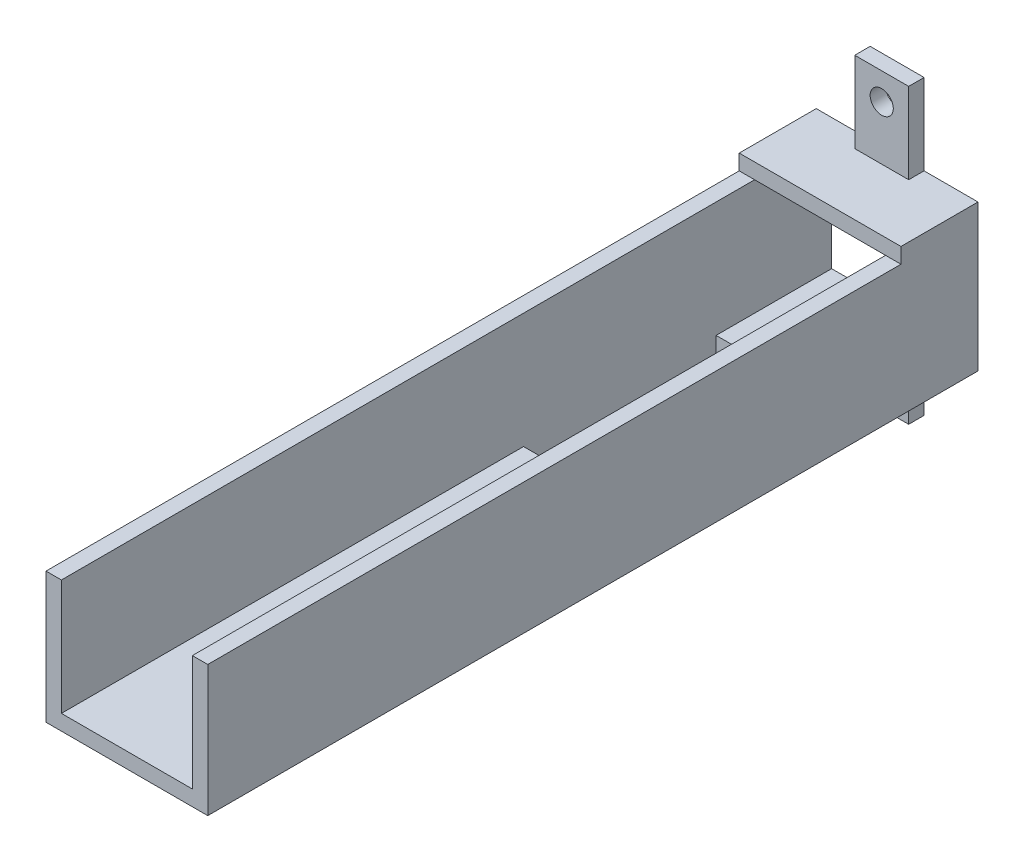
ISO-10303-21;
HEADER;
FILE_DESCRIPTION(('STEP AP214'),'2;1');
FILE_NAME('part.step','',(''),(''),'','','');
FILE_SCHEMA(('AUTOMOTIVE_DESIGN { 1 0 10303 214 1 1 1 1 }'));
ENDSEC;
DATA;
#1=APPLICATION_CONTEXT('core data for automotive mechanical design processes');
#2=APPLICATION_PROTOCOL_DEFINITION('international standard','automotive_design',2000,#1);
#3=PRODUCT_CONTEXT('',#1,'mechanical');
#4=PRODUCT('Part','Part','',(#3));
#5=PRODUCT_RELATED_PRODUCT_CATEGORY('part','',(#4));
#6=PRODUCT_DEFINITION_FORMATION('','',#4);
#7=PRODUCT_DEFINITION_CONTEXT('part definition',#1,'design');
#8=PRODUCT_DEFINITION('design','',#6,#7);
#9=PRODUCT_DEFINITION_SHAPE('','',#8);
#10=(LENGTH_UNIT() NAMED_UNIT(*) SI_UNIT(.MILLI.,.METRE.));
#11=(NAMED_UNIT(*) PLANE_ANGLE_UNIT() SI_UNIT($,.RADIAN.));
#12=(NAMED_UNIT(*) SI_UNIT($,.STERADIAN.) SOLID_ANGLE_UNIT());
#13=UNCERTAINTY_MEASURE_WITH_UNIT(LENGTH_MEASURE(1.E-05),#10,'distance_accuracy_value','');
#14=(GEOMETRIC_REPRESENTATION_CONTEXT(3) GLOBAL_UNCERTAINTY_ASSIGNED_CONTEXT((#13)) GLOBAL_UNIT_ASSIGNED_CONTEXT((#10,
#11,#12)) REPRESENTATION_CONTEXT('',''));
#15=CARTESIAN_POINT('',(0.,0.,0.));
#16=DIRECTION('',(0.,0.,1.));
#17=DIRECTION('',(1.,0.,0.));
#18=AXIS2_PLACEMENT_3D('',#15,#16,#17);
#19=CARTESIAN_POINT('',(-10.5,-2.00000000000001,100.));
#20=DIRECTION('',(0.,1.,0.));
#21=DIRECTION('',(0.,0.,1.));
#22=AXIS2_PLACEMENT_3D('',#19,#20,#21);
#23=PLANE('',#22);
#24=DIRECTION('',(1.,0.,0.));
#25=VECTOR('',#24,1.);
#26=CARTESIAN_POINT('',(-8.5,-2.00000000000001,40.));
#27=LINE('',#26,#25);
#28=CARTESIAN_POINT('',(-8.5,-2.00000000000001,40.));
#29=VERTEX_POINT('',#28);
#30=CARTESIAN_POINT('',(8.5,-2.00000000000001,40.));
#31=VERTEX_POINT('',#30);
#32=EDGE_CURVE('E341',#29,#31,#27,.T.);
#33=ORIENTED_EDGE('',*,*,#32,.T.);
#34=DIRECTION('',(0.,0.,-1.));
#35=VECTOR('',#34,1.);
#36=CARTESIAN_POINT('',(8.5,-2.00000000000001,40.));
#37=LINE('',#36,#35);
#38=CARTESIAN_POINT('',(8.5,-2.00000000000001,15.));
#39=VERTEX_POINT('',#38);
#40=EDGE_CURVE('E345',#31,#39,#37,.T.);
#41=ORIENTED_EDGE('',*,*,#40,.T.);
#42=DIRECTION('',(-1.,0.,0.));
#43=VECTOR('',#42,1.);
#44=CARTESIAN_POINT('',(8.5,-2.00000000000001,15.));
#45=LINE('',#44,#43);
#46=CARTESIAN_POINT('',(-8.5,-2.00000000000001,15.));
#47=VERTEX_POINT('',#46);
#48=EDGE_CURVE('E332',#39,#47,#45,.T.);
#49=ORIENTED_EDGE('',*,*,#48,.T.);
#50=DIRECTION('',(0.,0.,1.));
#51=VECTOR('',#50,1.);
#52=CARTESIAN_POINT('',(-8.5,-2.00000000000001,15.));
#53=LINE('',#52,#51);
#54=EDGE_CURVE('E336',#47,#29,#53,.T.);
#55=ORIENTED_EDGE('',*,*,#54,.T.);
#56=EDGE_LOOP('',(#33,#41,#49,#55));
#57=FACE_BOUND('',#56,.T.);
#58=DIRECTION('',(0.,0.,-1.));
#59=VECTOR('',#58,1.);
#60=CARTESIAN_POINT('',(-3.50000000000001,-2.,2.));
#61=LINE('',#60,#59);
#62=CARTESIAN_POINT('',(-3.50000000000001,-2.,2.));
#63=VERTEX_POINT('',#62);
#64=CARTESIAN_POINT('',(-3.50000000000001,-2.,0.));
#65=VERTEX_POINT('',#64);
#66=EDGE_CURVE('E241',#63,#65,#61,.T.);
#67=ORIENTED_EDGE('',*,*,#66,.F.);
#68=DIRECTION('',(1.,0.,0.));
#69=VECTOR('',#68,1.);
#70=CARTESIAN_POINT('',(-3.50000000000001,-2.,2.));
#71=LINE('',#70,#69);
#72=CARTESIAN_POINT('',(3.49999999999999,-2.,2.));
#73=VERTEX_POINT('',#72);
#74=EDGE_CURVE('E206',#63,#73,#71,.T.);
#75=ORIENTED_EDGE('',*,*,#74,.T.);
#76=DIRECTION('',(0.,0.,-1.));
#77=VECTOR('',#76,1.);
#78=CARTESIAN_POINT('',(3.49999999999999,-2.,2.));
#79=LINE('',#78,#77);
#80=CARTESIAN_POINT('',(3.49999999999999,-2.00000000000001,0.));
#81=VERTEX_POINT('',#80);
#82=EDGE_CURVE('E217',#73,#81,#79,.T.);
#83=ORIENTED_EDGE('',*,*,#82,.T.);
#84=DIRECTION('',(1.,0.,0.));
#85=VECTOR('',#84,1.);
#86=CARTESIAN_POINT('',(-10.5,-2.00000000000001,0.));
#87=LINE('',#86,#85);
#88=CARTESIAN_POINT('',(10.5,-2.00000000000001,0.));
#89=VERTEX_POINT('',#88);
#90=EDGE_CURVE('E403',#81,#89,#87,.T.);
#91=ORIENTED_EDGE('',*,*,#90,.T.);
#92=DIRECTION('',(0.,0.,-1.));
#93=VECTOR('',#92,1.);
#94=CARTESIAN_POINT('',(10.5,-2.00000000000001,100.));
#95=LINE('',#94,#93);
#96=CARTESIAN_POINT('',(10.5,-2.00000000000001,100.));
#97=VERTEX_POINT('',#96);
#98=EDGE_CURVE('E426',#97,#89,#95,.T.);
#99=ORIENTED_EDGE('',*,*,#98,.F.);
#100=DIRECTION('',(1.,0.,0.));
#101=VECTOR('',#100,1.);
#102=CARTESIAN_POINT('',(-10.5,-2.00000000000001,100.));
#103=LINE('',#102,#101);
#104=CARTESIAN_POINT('',(-10.5,-2.00000000000001,100.));
#105=VERTEX_POINT('',#104);
#106=EDGE_CURVE('E381',#105,#97,#103,.T.);
#107=ORIENTED_EDGE('',*,*,#106,.F.);
#108=DIRECTION('',(0.,0.,-1.));
#109=VECTOR('',#108,1.);
#110=CARTESIAN_POINT('',(-10.5,-2.00000000000001,100.));
#111=LINE('',#110,#109);
#112=CARTESIAN_POINT('',(-10.5,-2.00000000000001,0.));
#113=VERTEX_POINT('',#112);
#114=EDGE_CURVE('E430',#105,#113,#111,.T.);
#115=ORIENTED_EDGE('',*,*,#114,.T.);
#116=EDGE_CURVE('E404',#113,#65,#87,.T.);
#117=ORIENTED_EDGE('',*,*,#116,.T.);
#118=EDGE_LOOP('',(#67,#75,#83,#91,#99,#107,#115,#117));
#119=FACE_BOUND('',#118,.T.);
#120=ADVANCED_FACE('F39',(#57,#119),#23,.F.);
#121=CARTESIAN_POINT('',(-8.5,15.,100.));
#122=DIRECTION('',(0.,-1.,0.));
#123=DIRECTION('',(0.,0.,-1.));
#124=AXIS2_PLACEMENT_3D('',#121,#122,#123);
#125=PLANE('',#124);
#126=DIRECTION('',(-1.,0.,0.));
#127=VECTOR('',#126,1.);
#128=CARTESIAN_POINT('',(10.5,15.,10.));
#129=LINE('',#128,#127);
#130=CARTESIAN_POINT('',(-8.5,15.,9.99999999999999));
#131=VERTEX_POINT('',#130);
#132=CARTESIAN_POINT('',(-10.5,15.,9.99999999999999));
#133=VERTEX_POINT('',#132);
#134=EDGE_CURVE('E296',#131,#133,#129,.T.);
#135=ORIENTED_EDGE('',*,*,#134,.T.);
#136=DIRECTION('',(0.,0.,-1.));
#137=VECTOR('',#136,1.);
#138=CARTESIAN_POINT('',(-10.5,15.,100.));
#139=LINE('',#138,#137);
#140=CARTESIAN_POINT('',(-10.5,15.,100.));
#141=VERTEX_POINT('',#140);
#142=EDGE_CURVE('E434',#141,#133,#139,.T.);
#143=ORIENTED_EDGE('',*,*,#142,.F.);
#144=DIRECTION('',(-1.,0.,0.));
#145=VECTOR('',#144,1.);
#146=CARTESIAN_POINT('',(-8.5,15.,100.));
#147=LINE('',#146,#145);
#148=CARTESIAN_POINT('',(-8.5,15.,100.));
#149=VERTEX_POINT('',#148);
#150=EDGE_CURVE('E375',#149,#141,#147,.T.);
#151=ORIENTED_EDGE('',*,*,#150,.F.);
#152=DIRECTION('',(0.,0.,-1.));
#153=VECTOR('',#152,1.);
#154=CARTESIAN_POINT('',(-8.5,15.,100.));
#155=LINE('',#154,#153);
#156=EDGE_CURVE('E437',#149,#131,#155,.T.);
#157=ORIENTED_EDGE('',*,*,#156,.T.);
#158=EDGE_LOOP('',(#135,#143,#151,#157));
#159=FACE_BOUND('',#158,.T.);
#160=ADVANCED_FACE('F466',(#159),#125,.F.);
#161=CARTESIAN_POINT('',(10.5,15.,100.));
#162=DIRECTION('',(0.,-1.,0.));
#163=DIRECTION('',(0.,0.,-1.));
#164=AXIS2_PLACEMENT_3D('',#161,#162,#163);
#165=PLANE('',#164);
#166=CARTESIAN_POINT('',(10.5,15.,9.99999999999999));
#167=VERTEX_POINT('',#166);
#168=CARTESIAN_POINT('',(8.5,15.,9.99999999999999));
#169=VERTEX_POINT('',#168);
#170=EDGE_CURVE('E291',#167,#169,#129,.T.);
#171=ORIENTED_EDGE('',*,*,#170,.T.);
#172=DIRECTION('',(0.,0.,-1.));
#173=VECTOR('',#172,1.);
#174=CARTESIAN_POINT('',(8.5,15.,100.));
#175=LINE('',#174,#173);
#176=CARTESIAN_POINT('',(8.5,15.,100.));
#177=VERTEX_POINT('',#176);
#178=EDGE_CURVE('E419',#177,#169,#175,.T.);
#179=ORIENTED_EDGE('',*,*,#178,.F.);
#180=DIRECTION('',(-1.,0.,0.));
#181=VECTOR('',#180,1.);
#182=CARTESIAN_POINT('',(10.5,15.,100.));
#183=LINE('',#182,#181);
#184=CARTESIAN_POINT('',(10.5,15.,100.));
#185=VERTEX_POINT('',#184);
#186=EDGE_CURVE('E387',#185,#177,#183,.T.);
#187=ORIENTED_EDGE('',*,*,#186,.F.);
#188=DIRECTION('',(0.,0.,-1.));
#189=VECTOR('',#188,1.);
#190=CARTESIAN_POINT('',(10.5,15.,100.));
#191=LINE('',#190,#189);
#192=EDGE_CURVE('E423',#185,#167,#191,.T.);
#193=ORIENTED_EDGE('',*,*,#192,.T.);
#194=EDGE_LOOP('',(#171,#179,#187,#193));
#195=FACE_BOUND('',#194,.T.);
#196=ADVANCED_FACE('F516',(#195),#165,.F.);
#197=CARTESIAN_POINT('',(0.,0.,100.));
#198=DIRECTION('',(0.,-1.,0.));
#199=DIRECTION('',(1.,0.,0.));
#200=AXIS2_PLACEMENT_3D('',#197,#198,#199);
#201=PLANE('',#200);
#202=DIRECTION('',(0.,0.,-1.));
#203=VECTOR('',#202,1.);
#204=CARTESIAN_POINT('',(8.5,0.,100.));
#205=LINE('',#204,#203);
#206=CARTESIAN_POINT('',(8.5,0.,100.));
#207=VERTEX_POINT('',#206);
#208=CARTESIAN_POINT('',(8.5,0.,40.));
#209=VERTEX_POINT('',#208);
#210=EDGE_CURVE('E415',#207,#209,#205,.T.);
#211=ORIENTED_EDGE('',*,*,#210,.T.);
#212=DIRECTION('',(1.,0.,0.));
#213=VECTOR('',#212,1.);
#214=CARTESIAN_POINT('',(-8.5,0.,40.));
#215=LINE('',#214,#213);
#216=CARTESIAN_POINT('',(-8.5,0.,40.));
#217=VERTEX_POINT('',#216);
#218=EDGE_CURVE('E337',#217,#209,#215,.T.);
#219=ORIENTED_EDGE('',*,*,#218,.F.);
#220=DIRECTION('',(0.,0.,-1.));
#221=VECTOR('',#220,1.);
#222=CARTESIAN_POINT('',(-8.5,0.,100.));
#223=LINE('',#222,#221);
#224=CARTESIAN_POINT('',(-8.5,0.,100.));
#225=VERTEX_POINT('',#224);
#226=EDGE_CURVE('E11',#225,#217,#223,.T.);
#227=ORIENTED_EDGE('',*,*,#226,.F.);
#228=DIRECTION('',(-1.,0.,0.));
#229=VECTOR('',#228,1.);
#230=CARTESIAN_POINT('',(8.5,0.,100.));
#231=LINE('',#230,#229);
#232=EDGE_CURVE('E368',#207,#225,#231,.T.);
#233=ORIENTED_EDGE('',*,*,#232,.F.);
#234=EDGE_LOOP('',(#211,#219,#227,#233));
#235=FACE_BOUND('',#234,.T.);
#236=ADVANCED_FACE('F477',(#235),#201,.F.);
#237=CARTESIAN_POINT('',(-8.5,0.,15.));
#238=VERTEX_POINT('',#237);
#239=CARTESIAN_POINT('',(-8.5,0.,0.));
#240=VERTEX_POINT('',#239);
#241=EDGE_CURVE('E48',#238,#240,#223,.T.);
#242=ORIENTED_EDGE('',*,*,#241,.F.);
#243=DIRECTION('',(-1.,0.,0.));
#244=VECTOR('',#243,1.);
#245=CARTESIAN_POINT('',(0.,0.,15.));
#246=LINE('',#245,#244);
#247=CARTESIAN_POINT('',(8.5,0.,15.));
#248=VERTEX_POINT('',#247);
#249=EDGE_CURVE('E331',#248,#238,#246,.T.);
#250=ORIENTED_EDGE('',*,*,#249,.F.);
#251=CARTESIAN_POINT('',(8.5,0.,0.));
#252=VERTEX_POINT('',#251);
#253=EDGE_CURVE('E393',#248,#252,#205,.T.);
#254=ORIENTED_EDGE('',*,*,#253,.T.);
#255=DIRECTION('',(-1.,0.,0.));
#256=VECTOR('',#255,1.);
#257=CARTESIAN_POINT('',(0.,0.,0.));
#258=LINE('',#257,#256);
#259=EDGE_CURVE('E358',#252,#240,#258,.T.);
#260=ORIENTED_EDGE('',*,*,#259,.T.);
#261=EDGE_LOOP('',(#242,#250,#254,#260));
#262=FACE_BOUND('',#261,.T.);
#263=ADVANCED_FACE('F41',(#262),#201,.F.);
#264=CARTESIAN_POINT('',(-8.5,0.,100.));
#265=DIRECTION('',(-1.,0.,0.));
#266=DIRECTION('',(0.,0.,1.));
#267=AXIS2_PLACEMENT_3D('',#264,#265,#266);
#268=PLANE('',#267);
#269=DIRECTION('',(0.,1.,0.));
#270=VECTOR('',#269,1.);
#271=CARTESIAN_POINT('',(-8.5,0.,0.));
#272=LINE('',#271,#270);
#273=CARTESIAN_POINT('',(-8.5,15.,0.));
#274=VERTEX_POINT('',#273);
#275=EDGE_CURVE('E397',#240,#274,#272,.T.);
#276=ORIENTED_EDGE('',*,*,#275,.T.);
#277=DIRECTION('',(0.,0.,1.));
#278=VECTOR('',#277,1.);
#279=CARTESIAN_POINT('',(-8.5,15.,100.));
#280=LINE('',#279,#278);
#281=EDGE_CURVE('E328',#274,#131,#280,.T.);
#282=ORIENTED_EDGE('',*,*,#281,.T.);
#283=ORIENTED_EDGE('',*,*,#156,.F.);
#284=DIRECTION('',(0.,1.,0.));
#285=VECTOR('',#284,1.);
#286=CARTESIAN_POINT('',(-8.5,0.,100.));
#287=LINE('',#286,#285);
#288=EDGE_CURVE('E371',#225,#149,#287,.T.);
#289=ORIENTED_EDGE('',*,*,#288,.F.);
#290=ORIENTED_EDGE('',*,*,#226,.T.);
#291=DIRECTION('',(0.,1.,0.));
#292=VECTOR('',#291,1.);
#293=CARTESIAN_POINT('',(-8.5,-2.00000000000001,40.));
#294=LINE('',#293,#292);
#295=EDGE_CURVE('E363',#29,#217,#294,.T.);
#296=ORIENTED_EDGE('',*,*,#295,.F.);
#297=ORIENTED_EDGE('',*,*,#54,.F.);
#298=DIRECTION('',(0.,1.,0.));
#299=VECTOR('',#298,1.);
#300=CARTESIAN_POINT('',(-8.5,-2.00000000000001,15.));
#301=LINE('',#300,#299);
#302=EDGE_CURVE('E349',#47,#238,#301,.T.);
#303=ORIENTED_EDGE('',*,*,#302,.T.);
#304=ORIENTED_EDGE('',*,*,#241,.T.);
#305=EDGE_LOOP('',(#276,#282,#283,#289,#290,#296,#297,#303,#304));
#306=FACE_BOUND('',#305,.T.);
#307=ADVANCED_FACE('F447',(#306),#268,.F.);
#308=CARTESIAN_POINT('',(-10.5,15.,100.));
#309=DIRECTION('',(1.,0.,0.));
#310=DIRECTION('',(0.,0.,-1.));
#311=AXIS2_PLACEMENT_3D('',#308,#309,#310);
#312=PLANE('',#311);
#313=DIRECTION('',(0.,-1.,0.));
#314=VECTOR('',#313,1.);
#315=CARTESIAN_POINT('',(-10.5,15.,0.));
#316=LINE('',#315,#314);
#317=CARTESIAN_POINT('',(-10.5,17.,0.));
#318=VERTEX_POINT('',#317);
#319=EDGE_CURVE('E400',#318,#113,#316,.T.);
#320=ORIENTED_EDGE('',*,*,#319,.T.);
#321=ORIENTED_EDGE('',*,*,#114,.F.);
#322=DIRECTION('',(0.,-1.,0.));
#323=VECTOR('',#322,1.);
#324=CARTESIAN_POINT('',(-10.5,15.,100.));
#325=LINE('',#324,#323);
#326=EDGE_CURVE('E378',#141,#105,#325,.T.);
#327=ORIENTED_EDGE('',*,*,#326,.F.);
#328=ORIENTED_EDGE('',*,*,#142,.T.);
#329=DIRECTION('',(0.,1.,0.));
#330=VECTOR('',#329,1.);
#331=CARTESIAN_POINT('',(-10.5,15.,10.));
#332=LINE('',#331,#330);
#333=CARTESIAN_POINT('',(-10.5,17.,10.));
#334=VERTEX_POINT('',#333);
#335=EDGE_CURVE('E294',#133,#334,#332,.T.);
#336=ORIENTED_EDGE('',*,*,#335,.T.);
#337=DIRECTION('',(0.,0.,-1.));
#338=VECTOR('',#337,1.);
#339=CARTESIAN_POINT('',(-10.5,17.,10.));
#340=LINE('',#339,#338);
#341=EDGE_CURVE('E308',#334,#318,#340,.T.);
#342=ORIENTED_EDGE('',*,*,#341,.T.);
#343=EDGE_LOOP('',(#320,#321,#327,#328,#336,#342));
#344=FACE_BOUND('',#343,.T.);
#345=ADVANCED_FACE('F522',(#344),#312,.F.);
#346=CARTESIAN_POINT('',(10.5,-2.00000000000001,100.));
#347=DIRECTION('',(-1.,0.,0.));
#348=DIRECTION('',(0.,0.,1.));
#349=AXIS2_PLACEMENT_3D('',#346,#347,#348);
#350=PLANE('',#349);
#351=DIRECTION('',(0.,1.,0.));
#352=VECTOR('',#351,1.);
#353=CARTESIAN_POINT('',(10.5,-2.00000000000001,0.));
#354=LINE('',#353,#352);
#355=CARTESIAN_POINT('',(10.5,17.,0.));
#356=VERTEX_POINT('',#355);
#357=EDGE_CURVE('E408',#89,#356,#354,.T.);
#358=ORIENTED_EDGE('',*,*,#357,.T.);
#359=DIRECTION('',(0.,0.,-1.));
#360=VECTOR('',#359,1.);
#361=CARTESIAN_POINT('',(10.5,17.,10.));
#362=LINE('',#361,#360);
#363=CARTESIAN_POINT('',(10.5,17.,10.));
#364=VERTEX_POINT('',#363);
#365=EDGE_CURVE('E317',#364,#356,#362,.T.);
#366=ORIENTED_EDGE('',*,*,#365,.F.);
#367=DIRECTION('',(0.,-1.,0.));
#368=VECTOR('',#367,1.);
#369=CARTESIAN_POINT('',(10.5,15.,10.));
#370=LINE('',#369,#368);
#371=EDGE_CURVE('E304',#364,#167,#370,.T.);
#372=ORIENTED_EDGE('',*,*,#371,.T.);
#373=ORIENTED_EDGE('',*,*,#192,.F.);
#374=DIRECTION('',(0.,1.,0.));
#375=VECTOR('',#374,1.);
#376=CARTESIAN_POINT('',(10.5,-2.00000000000001,100.));
#377=LINE('',#376,#375);
#378=EDGE_CURVE('E384',#97,#185,#377,.T.);
#379=ORIENTED_EDGE('',*,*,#378,.F.);
#380=ORIENTED_EDGE('',*,*,#98,.T.);
#381=EDGE_LOOP('',(#358,#366,#372,#373,#379,#380));
#382=FACE_BOUND('',#381,.T.);
#383=ADVANCED_FACE('F501',(#382),#350,.F.);
#384=CARTESIAN_POINT('',(8.5,15.,100.));
#385=DIRECTION('',(1.,0.,0.));
#386=DIRECTION('',(0.,0.,-1.));
#387=AXIS2_PLACEMENT_3D('',#384,#385,#386);
#388=PLANE('',#387);
#389=DIRECTION('',(0.,-1.,0.));
#390=VECTOR('',#389,1.);
#391=CARTESIAN_POINT('',(8.5,15.,0.));
#392=LINE('',#391,#390);
#393=CARTESIAN_POINT('',(8.5,15.,0.));
#394=VERTEX_POINT('',#393);
#395=EDGE_CURVE('E372',#394,#252,#392,.T.);
#396=ORIENTED_EDGE('',*,*,#395,.T.);
#397=ORIENTED_EDGE('',*,*,#253,.F.);
#398=DIRECTION('',(0.,1.,0.));
#399=VECTOR('',#398,1.);
#400=CARTESIAN_POINT('',(8.5,-2.00000000000001,15.));
#401=LINE('',#400,#399);
#402=EDGE_CURVE('E355',#39,#248,#401,.T.);
#403=ORIENTED_EDGE('',*,*,#402,.F.);
#404=ORIENTED_EDGE('',*,*,#40,.F.);
#405=DIRECTION('',(0.,1.,0.));
#406=VECTOR('',#405,1.);
#407=CARTESIAN_POINT('',(8.5,-2.00000000000001,40.));
#408=LINE('',#407,#406);
#409=EDGE_CURVE('E359',#31,#209,#408,.T.);
#410=ORIENTED_EDGE('',*,*,#409,.T.);
#411=ORIENTED_EDGE('',*,*,#210,.F.);
#412=DIRECTION('',(0.,-1.,0.));
#413=VECTOR('',#412,1.);
#414=CARTESIAN_POINT('',(8.5,15.,100.));
#415=LINE('',#414,#413);
#416=EDGE_CURVE('E390',#177,#207,#415,.T.);
#417=ORIENTED_EDGE('',*,*,#416,.F.);
#418=ORIENTED_EDGE('',*,*,#178,.T.);
#419=DIRECTION('',(0.,0.,-1.));
#420=VECTOR('',#419,1.);
#421=CARTESIAN_POINT('',(8.5,15.,100.));
#422=LINE('',#421,#420);
#423=EDGE_CURVE('E321',#169,#394,#422,.T.);
#424=ORIENTED_EDGE('',*,*,#423,.T.);
#425=EDGE_LOOP('',(#396,#397,#403,#404,#410,#411,#417,#418,#424));
#426=FACE_BOUND('',#425,.T.);
#427=ADVANCED_FACE('F488',(#426),#388,.F.);
#428=CARTESIAN_POINT('',(0.,0.,100.));
#429=DIRECTION('',(0.,0.,-1.));
#430=DIRECTION('',(-1.,0.,0.));
#431=AXIS2_PLACEMENT_3D('',#428,#429,#430);
#432=PLANE('',#431);
#433=ORIENTED_EDGE('',*,*,#232,.T.);
#434=ORIENTED_EDGE('',*,*,#288,.T.);
#435=ORIENTED_EDGE('',*,*,#150,.T.);
#436=ORIENTED_EDGE('',*,*,#326,.T.);
#437=ORIENTED_EDGE('',*,*,#106,.T.);
#438=ORIENTED_EDGE('',*,*,#378,.T.);
#439=ORIENTED_EDGE('',*,*,#186,.T.);
#440=ORIENTED_EDGE('',*,*,#416,.T.);
#441=EDGE_LOOP('',(#433,#434,#435,#436,#437,#438,#439,#440));
#442=FACE_BOUND('',#441,.T.);
#443=ADVANCED_FACE('F469',(#442),#432,.F.);
#444=CARTESIAN_POINT('',(0.,0.,0.));
#445=DIRECTION('',(0.,0.,-1.));
#446=DIRECTION('',(-1.,0.,0.));
#447=AXIS2_PLACEMENT_3D('',#444,#445,#446);
#448=PLANE('',#447);
#449=ORIENTED_EDGE('',*,*,#395,.F.);
#450=DIRECTION('',(-1.,0.,0.));
#451=VECTOR('',#450,1.);
#452=CARTESIAN_POINT('',(10.5,15.,0.));
#453=LINE('',#452,#451);
#454=EDGE_CURVE('E281',#394,#274,#453,.T.);
#455=ORIENTED_EDGE('',*,*,#454,.T.);
#456=ORIENTED_EDGE('',*,*,#275,.F.);
#457=ORIENTED_EDGE('',*,*,#259,.F.);
#458=EDGE_LOOP('',(#449,#455,#456,#457));
#459=FACE_BOUND('',#458,.T.);
#460=DIRECTION('',(1.,0.,0.));
#461=VECTOR('',#460,1.);
#462=CARTESIAN_POINT('',(-10.5,17.,0.));
#463=LINE('',#462,#461);
#464=CARTESIAN_POINT('',(-3.50000000000001,17.,0.));
#465=VERTEX_POINT('',#464);
#466=EDGE_CURVE('E313',#318,#465,#463,.T.);
#467=ORIENTED_EDGE('',*,*,#466,.T.);
#468=DIRECTION('',(0.,1.,0.));
#469=VECTOR('',#468,1.);
#470=CARTESIAN_POINT('',(-3.50000000000001,20.5,0.));
#471=LINE('',#470,#469);
#472=CARTESIAN_POINT('',(-3.50000000000001,27.5,0.));
#473=VERTEX_POINT('',#472);
#474=EDGE_CURVE('E63',#465,#473,#471,.T.);
#475=ORIENTED_EDGE('',*,*,#474,.T.);
#476=DIRECTION('',(1.,0.,0.));
#477=VECTOR('',#476,1.);
#478=CARTESIAN_POINT('',(3.49999999999999,27.5,0.));
#479=LINE('',#478,#477);
#480=CARTESIAN_POINT('',(3.49999999999999,27.5,0.));
#481=VERTEX_POINT('',#480);
#482=EDGE_CURVE('E271',#473,#481,#479,.T.);
#483=ORIENTED_EDGE('',*,*,#482,.T.);
#484=DIRECTION('',(0.,-1.,0.));
#485=VECTOR('',#484,1.);
#486=CARTESIAN_POINT('',(3.49999999999999,17.,0.));
#487=LINE('',#486,#485);
#488=CARTESIAN_POINT('',(3.49999999999999,17.,0.));
#489=VERTEX_POINT('',#488);
#490=EDGE_CURVE('E258',#481,#489,#487,.T.);
#491=ORIENTED_EDGE('',*,*,#490,.T.);
#492=EDGE_CURVE('E312',#489,#356,#463,.T.);
#493=ORIENTED_EDGE('',*,*,#492,.T.);
#494=ORIENTED_EDGE('',*,*,#357,.F.);
#495=ORIENTED_EDGE('',*,*,#90,.F.);
#496=DIRECTION('',(0.,-1.,0.));
#497=VECTOR('',#496,1.);
#498=CARTESIAN_POINT('',(3.49999999999999,-2.,0.));
#499=LINE('',#498,#497);
#500=CARTESIAN_POINT('',(3.49999999999999,-10.5,0.));
#501=VERTEX_POINT('',#500);
#502=EDGE_CURVE('E55',#81,#501,#499,.T.);
#503=ORIENTED_EDGE('',*,*,#502,.T.);
#504=DIRECTION('',(-1.,0.,0.));
#505=VECTOR('',#504,1.);
#506=CARTESIAN_POINT('',(-3.50000000000001,-10.5,0.));
#507=LINE('',#506,#505);
#508=CARTESIAN_POINT('',(-3.50000000000001,-10.5,0.));
#509=VERTEX_POINT('',#508);
#510=EDGE_CURVE('E202',#501,#509,#507,.T.);
#511=ORIENTED_EDGE('',*,*,#510,.T.);
#512=DIRECTION('',(0.,1.,0.));
#513=VECTOR('',#512,1.);
#514=CARTESIAN_POINT('',(-3.50000000000001,-3.5,0.));
#515=LINE('',#514,#513);
#516=EDGE_CURVE('E222',#509,#65,#515,.T.);
#517=ORIENTED_EDGE('',*,*,#516,.T.);
#518=ORIENTED_EDGE('',*,*,#116,.F.);
#519=ORIENTED_EDGE('',*,*,#319,.F.);
#520=EDGE_LOOP('',(#467,#475,#483,#491,#493,#494,#495,#503,#511,#517,#518,#519));
#521=FACE_BOUND('',#520,.T.);
#522=CARTESIAN_POINT('',(0.,24.,0.));
#523=DIRECTION('',(0.,0.,-1.));
#524=DIRECTION('',(-1.,0.,0.));
#525=AXIS2_PLACEMENT_3D('',#522,#523,#524);
#526=CIRCLE('',#525,1.5);
#527=CARTESIAN_POINT('',(-1.50000000000001,24.,0.));
#528=VERTEX_POINT('',#527);
#529=EDGE_CURVE('E240',#528,#528,#526,.T.);
#530=ORIENTED_EDGE('',*,*,#529,.F.);
#531=EDGE_LOOP('',(#530));
#532=FACE_BOUND('',#531,.T.);
#533=CARTESIAN_POINT('',(0.,-7.,0.));
#534=DIRECTION('',(0.,0.,-1.));
#535=DIRECTION('',(-1.,0.,0.));
#536=AXIS2_PLACEMENT_3D('',#533,#534,#535);
#537=CIRCLE('',#536,1.5);
#538=CARTESIAN_POINT('',(-1.50000000000001,-7.,0.));
#539=VERTEX_POINT('',#538);
#540=EDGE_CURVE('E225',#539,#539,#537,.T.);
#541=ORIENTED_EDGE('',*,*,#540,.F.);
#542=EDGE_LOOP('',(#541));
#543=FACE_BOUND('',#542,.T.);
#544=ADVANCED_FACE('F456',(#459,#521,#532,#543),#448,.T.);
#545=CARTESIAN_POINT('',(-8.5,-2.00000000000001,40.));
#546=DIRECTION('',(0.,0.,1.));
#547=DIRECTION('',(1.,0.,0.));
#548=AXIS2_PLACEMENT_3D('',#545,#546,#547);
#549=PLANE('',#548);
#550=ORIENTED_EDGE('',*,*,#218,.T.);
#551=ORIENTED_EDGE('',*,*,#409,.F.);
#552=ORIENTED_EDGE('',*,*,#32,.F.);
#553=ORIENTED_EDGE('',*,*,#295,.T.);
#554=EDGE_LOOP('',(#550,#551,#552,#553));
#555=FACE_BOUND('',#554,.T.);
#556=ADVANCED_FACE('F480',(#555),#549,.F.);
#557=CARTESIAN_POINT('',(0.,-2.00000000000001,15.));
#558=DIRECTION('',(0.,0.,-1.));
#559=DIRECTION('',(-1.,0.,0.));
#560=AXIS2_PLACEMENT_3D('',#557,#558,#559);
#561=PLANE('',#560);
#562=ORIENTED_EDGE('',*,*,#249,.T.);
#563=ORIENTED_EDGE('',*,*,#302,.F.);
#564=ORIENTED_EDGE('',*,*,#48,.F.);
#565=ORIENTED_EDGE('',*,*,#402,.T.);
#566=EDGE_LOOP('',(#562,#563,#564,#565));
#567=FACE_BOUND('',#566,.T.);
#568=ADVANCED_FACE('F486',(#567),#561,.F.);
#569=CARTESIAN_POINT('',(10.5,15.,10.));
#570=DIRECTION('',(0.,-1.,0.));
#571=DIRECTION('',(0.,0.,-1.));
#572=AXIS2_PLACEMENT_3D('',#569,#570,#571);
#573=PLANE('',#572);
#574=ORIENTED_EDGE('',*,*,#281,.F.);
#575=ORIENTED_EDGE('',*,*,#454,.F.);
#576=ORIENTED_EDGE('',*,*,#423,.F.);
#577=EDGE_CURVE('E295',#169,#131,#129,.T.);
#578=ORIENTED_EDGE('',*,*,#577,.T.);
#579=EDGE_LOOP('',(#574,#575,#576,#578));
#580=FACE_BOUND('',#579,.T.);
#581=ADVANCED_FACE('F461',(#580),#573,.T.);
#582=CARTESIAN_POINT('',(-10.5,17.,10.));
#583=DIRECTION('',(0.,1.,0.));
#584=DIRECTION('',(0.,0.,1.));
#585=AXIS2_PLACEMENT_3D('',#582,#583,#584);
#586=PLANE('',#585);
#587=DIRECTION('',(0.,0.,-1.));
#588=VECTOR('',#587,1.);
#589=CARTESIAN_POINT('',(3.49999999999999,17.,2.));
#590=LINE('',#589,#588);
#591=CARTESIAN_POINT('',(3.49999999999999,17.,2.));
#592=VERTEX_POINT('',#591);
#593=EDGE_CURVE('E278',#592,#489,#590,.T.);
#594=ORIENTED_EDGE('',*,*,#593,.F.);
#595=DIRECTION('',(-1.,0.,0.));
#596=VECTOR('',#595,1.);
#597=CARTESIAN_POINT('',(-3.50000000000001,17.,2.));
#598=LINE('',#597,#596);
#599=CARTESIAN_POINT('',(-3.50000000000001,17.,2.));
#600=VERTEX_POINT('',#599);
#601=EDGE_CURVE('E253',#592,#600,#598,.T.);
#602=ORIENTED_EDGE('',*,*,#601,.T.);
#603=DIRECTION('',(0.,0.,-1.));
#604=VECTOR('',#603,1.);
#605=CARTESIAN_POINT('',(-3.50000000000001,17.,2.));
#606=LINE('',#605,#604);
#607=EDGE_CURVE('E268',#600,#465,#606,.T.);
#608=ORIENTED_EDGE('',*,*,#607,.T.);
#609=ORIENTED_EDGE('',*,*,#466,.F.);
#610=ORIENTED_EDGE('',*,*,#341,.F.);
#611=DIRECTION('',(1.,0.,0.));
#612=VECTOR('',#611,1.);
#613=CARTESIAN_POINT('',(-10.5,17.,10.));
#614=LINE('',#613,#612);
#615=EDGE_CURVE('E300',#334,#364,#614,.T.);
#616=ORIENTED_EDGE('',*,*,#615,.T.);
#617=ORIENTED_EDGE('',*,*,#365,.T.);
#618=ORIENTED_EDGE('',*,*,#492,.F.);
#619=EDGE_LOOP('',(#594,#602,#608,#609,#610,#616,#617,#618));
#620=FACE_BOUND('',#619,.T.);
#621=ADVANCED_FACE('F504',(#620),#586,.T.);
#622=CARTESIAN_POINT('',(0.,0.,10.));
#623=DIRECTION('',(0.,0.,-1.));
#624=DIRECTION('',(-1.,0.,0.));
#625=AXIS2_PLACEMENT_3D('',#622,#623,#624);
#626=PLANE('',#625);
#627=ORIENTED_EDGE('',*,*,#170,.F.);
#628=ORIENTED_EDGE('',*,*,#371,.F.);
#629=ORIENTED_EDGE('',*,*,#615,.F.);
#630=ORIENTED_EDGE('',*,*,#335,.F.);
#631=ORIENTED_EDGE('',*,*,#134,.F.);
#632=ORIENTED_EDGE('',*,*,#577,.F.);
#633=EDGE_LOOP('',(#627,#628,#629,#630,#631,#632));
#634=FACE_BOUND('',#633,.T.);
#635=ADVANCED_FACE('F511',(#634),#626,.F.);
#636=CARTESIAN_POINT('',(3.49999999999999,17.,2.));
#637=DIRECTION('',(1.,0.,0.));
#638=DIRECTION('',(0.,1.,0.));
#639=AXIS2_PLACEMENT_3D('',#636,#637,#638);
#640=PLANE('',#639);
#641=ORIENTED_EDGE('',*,*,#490,.F.);
#642=DIRECTION('',(0.,0.,-1.));
#643=VECTOR('',#642,1.);
#644=CARTESIAN_POINT('',(3.49999999999999,27.5,2.));
#645=LINE('',#644,#643);
#646=CARTESIAN_POINT('',(3.49999999999999,27.5,2.));
#647=VERTEX_POINT('',#646);
#648=EDGE_CURVE('E282',#647,#481,#645,.T.);
#649=ORIENTED_EDGE('',*,*,#648,.F.);
#650=DIRECTION('',(0.,-1.,0.));
#651=VECTOR('',#650,1.);
#652=CARTESIAN_POINT('',(3.49999999999999,27.5,2.));
#653=LINE('',#652,#651);
#654=EDGE_CURVE('E265',#647,#592,#653,.T.);
#655=ORIENTED_EDGE('',*,*,#654,.T.);
#656=ORIENTED_EDGE('',*,*,#593,.T.);
#657=EDGE_LOOP('',(#641,#649,#655,#656));
#658=FACE_BOUND('',#657,.T.);
#659=ADVANCED_FACE('F535',(#658),#640,.T.);
#660=CARTESIAN_POINT('',(3.49999999999999,27.5,2.));
#661=DIRECTION('',(0.,1.,0.));
#662=DIRECTION('',(0.,0.,1.));
#663=AXIS2_PLACEMENT_3D('',#660,#661,#662);
#664=PLANE('',#663);
#665=ORIENTED_EDGE('',*,*,#482,.F.);
#666=DIRECTION('',(0.,0.,-1.));
#667=VECTOR('',#666,1.);
#668=CARTESIAN_POINT('',(-3.50000000000001,27.5,2.));
#669=LINE('',#668,#667);
#670=CARTESIAN_POINT('',(-3.50000000000001,27.5,2.));
#671=VERTEX_POINT('',#670);
#672=EDGE_CURVE('E286',#671,#473,#669,.T.);
#673=ORIENTED_EDGE('',*,*,#672,.F.);
#674=DIRECTION('',(1.,0.,0.));
#675=VECTOR('',#674,1.);
#676=CARTESIAN_POINT('',(3.49999999999999,27.5,2.));
#677=LINE('',#676,#675);
#678=EDGE_CURVE('E261',#671,#647,#677,.T.);
#679=ORIENTED_EDGE('',*,*,#678,.T.);
#680=ORIENTED_EDGE('',*,*,#648,.T.);
#681=EDGE_LOOP('',(#665,#673,#679,#680));
#682=FACE_BOUND('',#681,.T.);
#683=ADVANCED_FACE('F533',(#682),#664,.T.);
#684=CARTESIAN_POINT('',(-3.50000000000001,20.5,2.));
#685=DIRECTION('',(-1.,0.,0.));
#686=DIRECTION('',(0.,0.,1.));
#687=AXIS2_PLACEMENT_3D('',#684,#685,#686);
#688=PLANE('',#687);
#689=ORIENTED_EDGE('',*,*,#474,.F.);
#690=ORIENTED_EDGE('',*,*,#607,.F.);
#691=DIRECTION('',(0.,1.,0.));
#692=VECTOR('',#691,1.);
#693=CARTESIAN_POINT('',(-3.50000000000001,20.5,2.));
#694=LINE('',#693,#692);
#695=EDGE_CURVE('E257',#600,#671,#694,.T.);
#696=ORIENTED_EDGE('',*,*,#695,.T.);
#697=ORIENTED_EDGE('',*,*,#672,.T.);
#698=EDGE_LOOP('',(#689,#690,#696,#697));
#699=FACE_BOUND('',#698,.T.);
#700=ADVANCED_FACE('F525',(#699),#688,.T.);
#701=CARTESIAN_POINT('',(0.,0.,2.));
#702=DIRECTION('',(0.,0.,1.));
#703=DIRECTION('',(1.,0.,0.));
#704=AXIS2_PLACEMENT_3D('',#701,#702,#703);
#705=PLANE('',#704);
#706=CARTESIAN_POINT('',(0.,24.,2.));
#707=DIRECTION('',(0.,0.,-1.));
#708=DIRECTION('',(-1.,0.,0.));
#709=AXIS2_PLACEMENT_3D('',#706,#707,#708);
#710=CIRCLE('',#709,1.5);
#711=CARTESIAN_POINT('',(-1.50000000000001,24.,2.));
#712=VERTEX_POINT('',#711);
#713=EDGE_CURVE('E246',#712,#712,#710,.T.);
#714=ORIENTED_EDGE('',*,*,#713,.T.);
#715=EDGE_LOOP('',(#714));
#716=FACE_BOUND('',#715,.T.);
#717=ORIENTED_EDGE('',*,*,#601,.F.);
#718=ORIENTED_EDGE('',*,*,#654,.F.);
#719=ORIENTED_EDGE('',*,*,#678,.F.);
#720=ORIENTED_EDGE('',*,*,#695,.F.);
#721=EDGE_LOOP('',(#717,#718,#719,#720));
#722=FACE_BOUND('',#721,.T.);
#723=ADVANCED_FACE('F529',(#716,#722),#705,.T.);
#724=CARTESIAN_POINT('',(0.,24.,2.));
#725=DIRECTION('',(0.,0.,-1.));
#726=DIRECTION('',(-1.,0.,0.));
#727=AXIS2_PLACEMENT_3D('',#724,#725,#726);
#728=CYLINDRICAL_SURFACE('',#727,1.5);
#729=ORIENTED_EDGE('',*,*,#713,.F.);
#730=EDGE_LOOP('',(#729));
#731=FACE_BOUND('',#730,.T.);
#732=ORIENTED_EDGE('',*,*,#529,.T.);
#733=EDGE_LOOP('',(#732));
#734=FACE_BOUND('',#733,.T.);
#735=ADVANCED_FACE('F589',(#731,#734),#728,.F.);
#736=CARTESIAN_POINT('',(3.49999999999999,-2.,2.));
#737=DIRECTION('',(1.,0.,0.));
#738=DIRECTION('',(0.,1.,0.));
#739=AXIS2_PLACEMENT_3D('',#736,#737,#738);
#740=PLANE('',#739);
#741=ORIENTED_EDGE('',*,*,#502,.F.);
#742=ORIENTED_EDGE('',*,*,#82,.F.);
#743=DIRECTION('',(0.,-1.,0.));
#744=VECTOR('',#743,1.);
#745=CARTESIAN_POINT('',(3.49999999999999,-10.5,2.));
#746=LINE('',#745,#744);
#747=CARTESIAN_POINT('',(3.49999999999999,-10.5,2.));
#748=VERTEX_POINT('',#747);
#749=EDGE_CURVE('E212',#73,#748,#746,.T.);
#750=ORIENTED_EDGE('',*,*,#749,.T.);
#751=DIRECTION('',(0.,0.,-1.));
#752=VECTOR('',#751,1.);
#753=CARTESIAN_POINT('',(3.49999999999999,-10.5,2.));
#754=LINE('',#753,#752);
#755=EDGE_CURVE('E196',#748,#501,#754,.T.);
#756=ORIENTED_EDGE('',*,*,#755,.T.);
#757=EDGE_LOOP('',(#741,#742,#750,#756));
#758=FACE_BOUND('',#757,.T.);
#759=ADVANCED_FACE('F216',(#758),#740,.T.);
#760=CARTESIAN_POINT('',(-3.50000000000001,-3.5,2.));
#761=DIRECTION('',(-1.,0.,0.));
#762=DIRECTION('',(0.,0.,1.));
#763=AXIS2_PLACEMENT_3D('',#760,#761,#762);
#764=PLANE('',#763);
#765=ORIENTED_EDGE('',*,*,#516,.F.);
#766=DIRECTION('',(0.,0.,-1.));
#767=VECTOR('',#766,1.);
#768=CARTESIAN_POINT('',(-3.50000000000001,-10.5,2.));
#769=LINE('',#768,#767);
#770=CARTESIAN_POINT('',(-3.50000000000001,-10.5,2.));
#771=VERTEX_POINT('',#770);
#772=EDGE_CURVE('E205',#771,#509,#769,.T.);
#773=ORIENTED_EDGE('',*,*,#772,.F.);
#774=DIRECTION('',(0.,1.,0.));
#775=VECTOR('',#774,1.);
#776=CARTESIAN_POINT('',(-3.50000000000001,-3.5,2.));
#777=LINE('',#776,#775);
#778=EDGE_CURVE('E213',#771,#63,#777,.T.);
#779=ORIENTED_EDGE('',*,*,#778,.T.);
#780=ORIENTED_EDGE('',*,*,#66,.T.);
#781=EDGE_LOOP('',(#765,#773,#779,#780));
#782=FACE_BOUND('',#781,.T.);
#783=ADVANCED_FACE('F599',(#782),#764,.T.);
#784=CARTESIAN_POINT('',(-3.50000000000001,-10.5,2.));
#785=DIRECTION('',(0.,-1.,0.));
#786=DIRECTION('',(0.,0.,-1.));
#787=AXIS2_PLACEMENT_3D('',#784,#785,#786);
#788=PLANE('',#787);
#789=ORIENTED_EDGE('',*,*,#510,.F.);
#790=ORIENTED_EDGE('',*,*,#755,.F.);
#791=DIRECTION('',(-1.,0.,0.));
#792=VECTOR('',#791,1.);
#793=CARTESIAN_POINT('',(-3.50000000000001,-10.5,2.));
#794=LINE('',#793,#792);
#795=EDGE_CURVE('E200',#748,#771,#794,.T.);
#796=ORIENTED_EDGE('',*,*,#795,.T.);
#797=ORIENTED_EDGE('',*,*,#772,.T.);
#798=EDGE_LOOP('',(#789,#790,#796,#797));
#799=FACE_BOUND('',#798,.T.);
#800=ADVANCED_FACE('F198',(#799),#788,.T.);
#801=CARTESIAN_POINT('',(0.,0.,2.));
#802=DIRECTION('',(0.,0.,-1.));
#803=DIRECTION('',(-1.,0.,0.));
#804=AXIS2_PLACEMENT_3D('',#801,#802,#803);
#805=PLANE('',#804);
#806=CARTESIAN_POINT('',(0.,-7.,2.));
#807=DIRECTION('',(0.,0.,-1.));
#808=DIRECTION('',(-1.,0.,0.));
#809=AXIS2_PLACEMENT_3D('',#806,#807,#808);
#810=CIRCLE('',#809,1.5);
#811=CARTESIAN_POINT('',(-1.50000000000001,-7.,2.));
#812=VERTEX_POINT('',#811);
#813=EDGE_CURVE('E234',#812,#812,#810,.T.);
#814=ORIENTED_EDGE('',*,*,#813,.T.);
#815=EDGE_LOOP('',(#814));
#816=FACE_BOUND('',#815,.T.);
#817=ORIENTED_EDGE('',*,*,#749,.F.);
#818=ORIENTED_EDGE('',*,*,#74,.F.);
#819=ORIENTED_EDGE('',*,*,#778,.F.);
#820=ORIENTED_EDGE('',*,*,#795,.F.);
#821=EDGE_LOOP('',(#817,#818,#819,#820));
#822=FACE_BOUND('',#821,.T.);
#823=ADVANCED_FACE('F210',(#816,#822),#805,.F.);
#824=CARTESIAN_POINT('',(0.,-7.,2.));
#825=DIRECTION('',(0.,0.,-1.));
#826=DIRECTION('',(-1.,0.,0.));
#827=AXIS2_PLACEMENT_3D('',#824,#825,#826);
#828=CYLINDRICAL_SURFACE('',#827,1.5);
#829=ORIENTED_EDGE('',*,*,#813,.F.);
#830=EDGE_LOOP('',(#829));
#831=FACE_BOUND('',#830,.T.);
#832=ORIENTED_EDGE('',*,*,#540,.T.);
#833=EDGE_LOOP('',(#832));
#834=FACE_BOUND('',#833,.T.);
#835=ADVANCED_FACE('F606',(#831,#834),#828,.F.);
#836=CLOSED_SHELL('',(#120,#160,#196,#236,#263,#307,#345,#383,#427,#443,#544,#556,#568,#581,
#621,#635,#659,#683,#700,#723,#735,#759,#783,#800,#823,#835));
#837=MANIFOLD_SOLID_BREP('B2',#836);
#838=ADVANCED_BREP_SHAPE_REPRESENTATION('',(#18,#837),#14);
#839=SHAPE_DEFINITION_REPRESENTATION(#9,#838);
ENDSEC;
END-ISO-10303-21;
